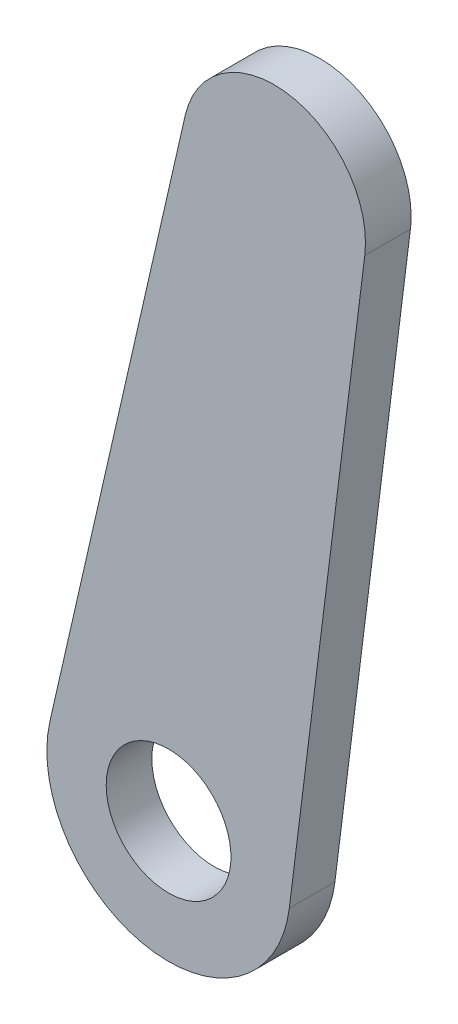
ISO-10303-21;
HEADER;
FILE_DESCRIPTION(('STEP AP214'),'2;1');
FILE_NAME('part.step','',(''),(''),'','','');
FILE_SCHEMA(('AUTOMOTIVE_DESIGN { 1 0 10303 214 1 1 1 1 }'));
ENDSEC;
DATA;
#1=APPLICATION_CONTEXT('core data for automotive mechanical design processes');
#2=APPLICATION_PROTOCOL_DEFINITION('international standard','automotive_design',2000,#1);
#3=PRODUCT_CONTEXT('',#1,'mechanical');
#4=PRODUCT('Part','Part','',(#3));
#5=PRODUCT_RELATED_PRODUCT_CATEGORY('part','',(#4));
#6=PRODUCT_DEFINITION_FORMATION('','',#4);
#7=PRODUCT_DEFINITION_CONTEXT('part definition',#1,'design');
#8=PRODUCT_DEFINITION('design','',#6,#7);
#9=PRODUCT_DEFINITION_SHAPE('','',#8);
#10=(LENGTH_UNIT() NAMED_UNIT(*) SI_UNIT(.MILLI.,.METRE.));
#11=(NAMED_UNIT(*) PLANE_ANGLE_UNIT() SI_UNIT($,.RADIAN.));
#12=(NAMED_UNIT(*) SI_UNIT($,.STERADIAN.) SOLID_ANGLE_UNIT());
#13=UNCERTAINTY_MEASURE_WITH_UNIT(LENGTH_MEASURE(1.E-05),#10,'distance_accuracy_value','');
#14=(GEOMETRIC_REPRESENTATION_CONTEXT(3) GLOBAL_UNCERTAINTY_ASSIGNED_CONTEXT((#13)) GLOBAL_UNIT_ASSIGNED_CONTEXT((#10,
#11,#12)) REPRESENTATION_CONTEXT('',''));
#15=CARTESIAN_POINT('',(0.,0.,0.));
#16=DIRECTION('',(0.,0.,1.));
#17=DIRECTION('',(1.,0.,0.));
#18=AXIS2_PLACEMENT_3D('',#15,#16,#17);
#19=CARTESIAN_POINT('',(7.93806705488001,-0.993524751694006,3.));
#20=DIRECTION('',(0.992258381860001,-0.124190593961751,0.));
#21=DIRECTION('',(0.124190593961751,0.992258381860001,0.));
#22=AXIS2_PLACEMENT_3D('',#19,#20,#21);
#23=PLANE('',#22);
#24=DIRECTION('',(-0.124190593961751,-0.992258381860001,0.));
#25=VECTOR('',#24,1.);
#26=CARTESIAN_POINT('',(7.93806705488001,-0.993524751694006,0.));
#27=LINE('',#26,#25);
#28=CARTESIAN_POINT('',(12.8994773978371,38.6471665567178,0.));
#29=VERTEX_POINT('',#28);
#30=CARTESIAN_POINT('',(7.93806705488001,-0.993524751694006,0.));
#31=VERTEX_POINT('',#30);
#32=EDGE_CURVE('E107',#29,#31,#27,.T.);
#33=ORIENTED_EDGE('',*,*,#32,.F.);
#34=DIRECTION('',(0.,0.,-1.));
#35=VECTOR('',#34,1.);
#36=CARTESIAN_POINT('',(12.8994773978371,38.6471665567178,3.));
#37=LINE('',#36,#35);
#38=CARTESIAN_POINT('',(12.8994773978371,38.6471665567178,3.));
#39=VERTEX_POINT('',#38);
#40=EDGE_CURVE('E91',#39,#29,#37,.T.);
#41=ORIENTED_EDGE('',*,*,#40,.F.);
#42=DIRECTION('',(-0.124190593961751,-0.992258381860001,0.));
#43=VECTOR('',#42,1.);
#44=CARTESIAN_POINT('',(7.93806705488001,-0.993524751694006,3.));
#45=LINE('',#44,#43);
#46=CARTESIAN_POINT('',(7.93806705488001,-0.993524751694006,3.));
#47=VERTEX_POINT('',#46);
#48=EDGE_CURVE('E126',#39,#47,#45,.T.);
#49=ORIENTED_EDGE('',*,*,#48,.T.);
#50=DIRECTION('',(0.,0.,-1.));
#51=VECTOR('',#50,1.);
#52=CARTESIAN_POINT('',(7.93806705488001,-0.993524751694006,3.));
#53=LINE('',#52,#51);
#54=EDGE_CURVE('E86',#47,#31,#53,.T.);
#55=ORIENTED_EDGE('',*,*,#54,.T.);
#56=EDGE_LOOP('',(#33,#41,#49,#55));
#57=FACE_BOUND('',#56,.T.);
#58=ADVANCED_FACE('F45',(#57),#23,.T.);
#59=CARTESIAN_POINT('',(6.94592710667709,39.3923101204883,3.));
#60=DIRECTION('',(0.,0.,-1.));
#61=DIRECTION('',(-1.,0.,0.));
#62=AXIS2_PLACEMENT_3D('',#59,#60,#61);
#63=CYLINDRICAL_SURFACE('',#62,6.);
#64=ORIENTED_EDGE('',*,*,#40,.T.);
#65=CARTESIAN_POINT('',(6.94592710667709,39.3923101204883,0.));
#66=DIRECTION('',(0.,0.,1.));
#67=DIRECTION('',(1.,0.,0.));
#68=AXIS2_PLACEMENT_3D('',#65,#66,#67);
#69=CIRCLE('',#68,6.);
#70=CARTESIAN_POINT('',(1.09656572211724,40.7283383360662,0.));
#71=VERTEX_POINT('',#70);
#72=EDGE_CURVE('E56',#29,#71,#69,.T.);
#73=ORIENTED_EDGE('',*,*,#72,.T.);
#74=DIRECTION('',(0.,0.,-1.));
#75=VECTOR('',#74,1.);
#76=CARTESIAN_POINT('',(1.09656572211724,40.7283383360662,3.));
#77=LINE('',#76,#75);
#78=CARTESIAN_POINT('',(1.09656572211724,40.7283383360662,3.));
#79=VERTEX_POINT('',#78);
#80=EDGE_CURVE('E114',#79,#71,#77,.T.);
#81=ORIENTED_EDGE('',*,*,#80,.F.);
#82=CARTESIAN_POINT('',(6.94592710667709,39.3923101204883,3.));
#83=DIRECTION('',(0.,0.,1.));
#84=DIRECTION('',(1.,0.,0.));
#85=AXIS2_PLACEMENT_3D('',#82,#83,#84);
#86=CIRCLE('',#85,6.);
#87=EDGE_CURVE('E112',#39,#79,#86,.T.);
#88=ORIENTED_EDGE('',*,*,#87,.F.);
#89=EDGE_LOOP('',(#64,#73,#81,#88));
#90=FACE_BOUND('',#89,.T.);
#91=ADVANCED_FACE('F111',(#90),#63,.T.);
#92=CARTESIAN_POINT('',(-7.79914851274647,1.78137095410377,3.));
#93=DIRECTION('',(0.974893564093308,-0.222671369262971,0.));
#94=DIRECTION('',(0.222671369262972,0.974893564093308,0.));
#95=AXIS2_PLACEMENT_3D('',#92,#93,#94);
#96=PLANE('',#95);
#97=DIRECTION('',(-0.222671369262972,-0.974893564093308,0.));
#98=VECTOR('',#97,1.);
#99=CARTESIAN_POINT('',(-7.79914851274647,1.78137095410377,0.));
#100=LINE('',#99,#98);
#101=CARTESIAN_POINT('',(-7.79914851274647,1.78137095410377,0.));
#102=VERTEX_POINT('',#101);
#103=EDGE_CURVE('E79',#71,#102,#100,.T.);
#104=ORIENTED_EDGE('',*,*,#103,.T.);
#105=DIRECTION('',(0.,0.,-1.));
#106=VECTOR('',#105,1.);
#107=CARTESIAN_POINT('',(-7.79914851274647,1.78137095410377,3.));
#108=LINE('',#107,#106);
#109=CARTESIAN_POINT('',(-7.79914851274647,1.78137095410377,3.));
#110=VERTEX_POINT('',#109);
#111=EDGE_CURVE('E129',#110,#102,#108,.T.);
#112=ORIENTED_EDGE('',*,*,#111,.F.);
#113=DIRECTION('',(-0.222671369262972,-0.974893564093308,0.));
#114=VECTOR('',#113,1.);
#115=CARTESIAN_POINT('',(-7.79914851274647,1.78137095410377,3.));
#116=LINE('',#115,#114);
#117=EDGE_CURVE('E135',#79,#110,#116,.T.);
#118=ORIENTED_EDGE('',*,*,#117,.F.);
#119=ORIENTED_EDGE('',*,*,#80,.T.);
#120=EDGE_LOOP('',(#104,#112,#118,#119));
#121=FACE_BOUND('',#120,.T.);
#122=ADVANCED_FACE('F134',(#121),#96,.F.);
#123=CARTESIAN_POINT('',(0.,0.,3.));
#124=DIRECTION('',(0.,0.,-1.));
#125=DIRECTION('',(-1.,0.,0.));
#126=AXIS2_PLACEMENT_3D('',#123,#124,#125);
#127=CYLINDRICAL_SURFACE('',#126,8.);
#128=CARTESIAN_POINT('',(0.,0.,0.));
#129=DIRECTION('',(0.,0.,1.));
#130=DIRECTION('',(1.,0.,0.));
#131=AXIS2_PLACEMENT_3D('',#128,#129,#130);
#132=CIRCLE('',#131,8.);
#133=EDGE_CURVE('E119',#102,#31,#132,.T.);
#134=ORIENTED_EDGE('',*,*,#133,.T.);
#135=ORIENTED_EDGE('',*,*,#54,.F.);
#136=CARTESIAN_POINT('',(0.,0.,3.));
#137=DIRECTION('',(0.,0.,1.));
#138=DIRECTION('',(1.,0.,0.));
#139=AXIS2_PLACEMENT_3D('',#136,#137,#138);
#140=CIRCLE('',#139,8.);
#141=EDGE_CURVE('E64',#110,#47,#140,.T.);
#142=ORIENTED_EDGE('',*,*,#141,.F.);
#143=ORIENTED_EDGE('',*,*,#111,.T.);
#144=EDGE_LOOP('',(#134,#135,#142,#143));
#145=FACE_BOUND('',#144,.T.);
#146=ADVANCED_FACE('F168',(#145),#127,.T.);
#147=CARTESIAN_POINT('',(0.,0.,3.));
#148=DIRECTION('',(0.,0.,1.));
#149=DIRECTION('',(1.,0.,0.));
#150=AXIS2_PLACEMENT_3D('',#147,#148,#149);
#151=PLANE('',#150);
#152=CARTESIAN_POINT('',(0.,0.,3.));
#153=DIRECTION('',(0.,0.,-1.));
#154=DIRECTION('',(-1.,0.,0.));
#155=AXIS2_PLACEMENT_3D('',#152,#153,#154);
#156=CIRCLE('',#155,4.1);
#157=CARTESIAN_POINT('',(-4.1,0.,3.));
#158=VERTEX_POINT('',#157);
#159=EDGE_CURVE('E109',#158,#158,#156,.T.);
#160=ORIENTED_EDGE('',*,*,#159,.T.);
#161=EDGE_LOOP('',(#160));
#162=FACE_BOUND('',#161,.T.);
#163=ORIENTED_EDGE('',*,*,#48,.F.);
#164=ORIENTED_EDGE('',*,*,#87,.T.);
#165=ORIENTED_EDGE('',*,*,#117,.T.);
#166=ORIENTED_EDGE('',*,*,#141,.T.);
#167=EDGE_LOOP('',(#163,#164,#165,#166));
#168=FACE_BOUND('',#167,.T.);
#169=ADVANCED_FACE('F151',(#162,#168),#151,.T.);
#170=CARTESIAN_POINT('',(0.,0.,0.));
#171=DIRECTION('',(0.,0.,1.));
#172=DIRECTION('',(1.,0.,0.));
#173=AXIS2_PLACEMENT_3D('',#170,#171,#172);
#174=PLANE('',#173);
#175=CARTESIAN_POINT('',(0.,0.,0.));
#176=DIRECTION('',(0.,0.,-1.));
#177=DIRECTION('',(-1.,0.,0.));
#178=AXIS2_PLACEMENT_3D('',#175,#176,#177);
#179=CIRCLE('',#178,4.1);
#180=CARTESIAN_POINT('',(-4.1,0.,0.));
#181=VERTEX_POINT('',#180);
#182=EDGE_CURVE('E143',#181,#181,#179,.T.);
#183=ORIENTED_EDGE('',*,*,#182,.F.);
#184=EDGE_LOOP('',(#183));
#185=FACE_BOUND('',#184,.T.);
#186=ORIENTED_EDGE('',*,*,#103,.F.);
#187=CARTESIAN_POINT('',(6.94592710667709,39.3923101204883,0.));
#188=DIRECTION('',(0.,0.,1.));
#189=DIRECTION('',(1.,0.,0.));
#190=AXIS2_PLACEMENT_3D('',#187,#188,#189);
#191=CIRCLE('',#190,6.);
#192=EDGE_CURVE('E99',#71,#29,#191,.T.);
#193=ORIENTED_EDGE('',*,*,#192,.T.);
#194=ORIENTED_EDGE('',*,*,#32,.T.);
#195=ORIENTED_EDGE('',*,*,#133,.F.);
#196=EDGE_LOOP('',(#186,#193,#194,#195));
#197=FACE_BOUND('',#196,.T.);
#198=ADVANCED_FACE('F105',(#185,#197),#174,.F.);
#199=CARTESIAN_POINT('',(6.94592710667709,39.3923101204883,-5.));
#200=DIRECTION('',(0.,1.,0.));
#201=DIRECTION('',(0.,0.,-1.));
#202=AXIS2_PLACEMENT_3D('',#199,#200,#201);
#203=SPHERICAL_SURFACE('',#202,4.);
#204=CARTESIAN_POINT('',(6.94592710667709,39.3923101204883,-5.));
#205=DIRECTION('',(0.,0.,1.));
#206=DIRECTION('',(1.,0.,0.));
#207=AXIS2_PLACEMENT_3D('',#204,#205,#206);
#208=SPHERICAL_SURFACE('',#207,4.);
#209=CARTESIAN_POINT('',(6.94592710667709,39.3923101204883,-1.96189209298539));
#210=DIRECTION('',(0.,0.,1.));
#211=DIRECTION('',(1.,0.,0.));
#212=AXIS2_PLACEMENT_3D('',#209,#210,#211);
#213=CIRCLE('',#212,2.60190321598159);
#214=CARTESIAN_POINT('',(9.54783032265868,39.3923101204883,-1.96189209298539));
#215=VERTEX_POINT('',#214);
#216=EDGE_CURVE('E11',#215,#215,#213,.F.);
#217=ORIENTED_EDGE('',*,*,#216,.T.);
#218=EDGE_LOOP('',(#217));
#219=FACE_BOUND('',#218,.T.);
#220=ADVANCED_FACE('F160',(#219),#208,.F.);
#221=CARTESIAN_POINT('',(6.94592710667709,39.3923101204883,0.));
#222=DIRECTION('',(0.,0.,1.));
#223=DIRECTION('',(1.,0.,0.));
#224=AXIS2_PLACEMENT_3D('',#221,#222,#223);
#225=CONICAL_SURFACE('',#224,6.,1.0471975511966);
#226=ORIENTED_EDGE('',*,*,#216,.F.);
#227=EDGE_LOOP('',(#226));
#228=FACE_BOUND('',#227,.T.);
#229=ORIENTED_EDGE('',*,*,#72,.F.);
#230=ORIENTED_EDGE('',*,*,#192,.F.);
#231=EDGE_LOOP('',(#229,#230));
#232=FACE_BOUND('',#231,.T.);
#233=ADVANCED_FACE('F48',(#228,#232),#225,.T.);
#234=CARTESIAN_POINT('',(0.,0.,3.));
#235=DIRECTION('',(0.,0.,-1.));
#236=DIRECTION('',(-1.,0.,0.));
#237=AXIS2_PLACEMENT_3D('',#234,#235,#236);
#238=CYLINDRICAL_SURFACE('',#237,4.1);
#239=ORIENTED_EDGE('',*,*,#159,.F.);
#240=EDGE_LOOP('',(#239));
#241=FACE_BOUND('',#240,.T.);
#242=ORIENTED_EDGE('',*,*,#182,.T.);
#243=EDGE_LOOP('',(#242));
#244=FACE_BOUND('',#243,.T.);
#245=ADVANCED_FACE('F153',(#241,#244),#238,.F.);
#246=CLOSED_SHELL('',(#58,#91,#122,#146,#169,#198,#220,#233,#245));
#247=MANIFOLD_SOLID_BREP('B2',#246);
#248=ADVANCED_BREP_SHAPE_REPRESENTATION('',(#18,#247),#14);
#249=SHAPE_DEFINITION_REPRESENTATION(#9,#248);
ENDSEC;
END-ISO-10303-21;
